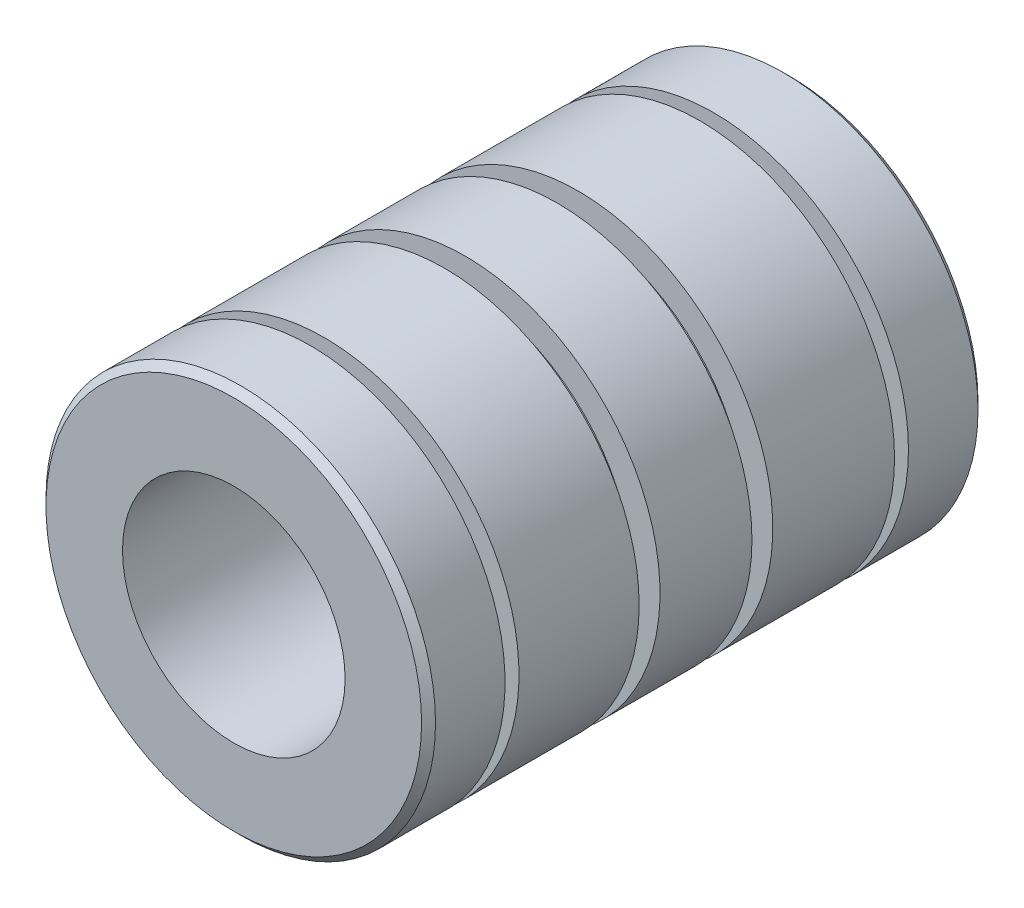
ISO-10303-21;
HEADER;
FILE_DESCRIPTION(('STEP AP214'),'2;1');
FILE_NAME('part.step','',(''),(''),'','','');
FILE_SCHEMA(('AUTOMOTIVE_DESIGN { 1 0 10303 214 1 1 1 1 }'));
ENDSEC;
DATA;
#1=APPLICATION_CONTEXT('core data for automotive mechanical design processes');
#2=APPLICATION_PROTOCOL_DEFINITION('international standard','automotive_design',2000,#1);
#3=PRODUCT_CONTEXT('',#1,'mechanical');
#4=PRODUCT('Part','Part','',(#3));
#5=PRODUCT_RELATED_PRODUCT_CATEGORY('part','',(#4));
#6=PRODUCT_DEFINITION_FORMATION('','',#4);
#7=PRODUCT_DEFINITION_CONTEXT('part definition',#1,'design');
#8=PRODUCT_DEFINITION('design','',#6,#7);
#9=PRODUCT_DEFINITION_SHAPE('','',#8);
#10=(LENGTH_UNIT() NAMED_UNIT(*) SI_UNIT(.MILLI.,.METRE.));
#11=(NAMED_UNIT(*) PLANE_ANGLE_UNIT() SI_UNIT($,.RADIAN.));
#12=(NAMED_UNIT(*) SI_UNIT($,.STERADIAN.) SOLID_ANGLE_UNIT());
#13=UNCERTAINTY_MEASURE_WITH_UNIT(LENGTH_MEASURE(1.E-05),#10,'distance_accuracy_value','');
#14=(GEOMETRIC_REPRESENTATION_CONTEXT(3) GLOBAL_UNCERTAINTY_ASSIGNED_CONTEXT((#13)) GLOBAL_UNIT_ASSIGNED_CONTEXT((#10,
#11,#12)) REPRESENTATION_CONTEXT('',''));
#15=CARTESIAN_POINT('',(0.,0.,0.));
#16=DIRECTION('',(0.,0.,1.));
#17=DIRECTION('',(1.,0.,0.));
#18=AXIS2_PLACEMENT_3D('',#15,#16,#17);
#19=CARTESIAN_POINT('',(0.,0.,31.75));
#20=DIRECTION('',(0.,0.,-1.));
#21=DIRECTION('',(-1.,0.,0.));
#22=AXIS2_PLACEMENT_3D('',#19,#20,#21);
#23=CYLINDRICAL_SURFACE('',#22,11.1125);
#24=CARTESIAN_POINT('',(0.,0.,19.7330901235873));
#25=DIRECTION('',(0.,0.,1.));
#26=DIRECTION('',(1.,0.,0.));
#27=AXIS2_PLACEMENT_3D('',#24,#25,#26);
#28=CIRCLE('',#27,11.1125);
#29=CARTESIAN_POINT('',(11.1125,0.,19.7330901235873));
#30=VERTEX_POINT('',#29);
#31=EDGE_CURVE('E48',#30,#30,#28,.T.);
#32=ORIENTED_EDGE('',*,*,#31,.T.);
#33=EDGE_LOOP('',(#32));
#34=FACE_BOUND('',#33,.T.);
#35=CARTESIAN_POINT('',(0.,0.,26.590625));
#36=DIRECTION('',(0.,0.,-1.));
#37=DIRECTION('',(-1.,0.,0.));
#38=AXIS2_PLACEMENT_3D('',#35,#36,#37);
#39=CIRCLE('',#38,11.1125);
#40=CARTESIAN_POINT('',(-11.1125,0.,26.590625));
#41=VERTEX_POINT('',#40);
#42=EDGE_CURVE('E100',#41,#41,#39,.T.);
#43=ORIENTED_EDGE('',*,*,#42,.T.);
#44=EDGE_LOOP('',(#43));
#45=FACE_BOUND('',#44,.T.);
#46=ADVANCED_FACE('F44',(#34,#45),#23,.T.);
#47=CARTESIAN_POINT('',(0.,0.,12.1046875));
#48=DIRECTION('',(0.,0.,-1.));
#49=DIRECTION('',(-1.,0.,0.));
#50=AXIS2_PLACEMENT_3D('',#47,#48,#49);
#51=CIRCLE('',#50,11.1125);
#52=CARTESIAN_POINT('',(-11.1125,0.,12.1046875));
#53=VERTEX_POINT('',#52);
#54=EDGE_CURVE('E64',#53,#53,#51,.T.);
#55=ORIENTED_EDGE('',*,*,#54,.T.);
#56=EDGE_LOOP('',(#55));
#57=FACE_BOUND('',#56,.T.);
#58=CARTESIAN_POINT('',(0.,0.,5.15937499999999));
#59=DIRECTION('',(0.,0.,1.));
#60=DIRECTION('',(1.,0.,0.));
#61=AXIS2_PLACEMENT_3D('',#58,#59,#60);
#62=CIRCLE('',#61,11.1125);
#63=CARTESIAN_POINT('',(11.1125,0.,5.15937499999999));
#64=VERTEX_POINT('',#63);
#65=EDGE_CURVE('E97',#64,#64,#62,.T.);
#66=ORIENTED_EDGE('',*,*,#65,.T.);
#67=EDGE_LOOP('',(#66));
#68=FACE_BOUND('',#67,.T.);
#69=ADVANCED_FACE('F134',(#57,#68),#23,.T.);
#70=CARTESIAN_POINT('',(0.,0.,0.396874999999991));
#71=DIRECTION('',(0.,0.,1.));
#72=DIRECTION('',(1.,0.,0.));
#73=AXIS2_PLACEMENT_3D('',#70,#71,#72);
#74=CIRCLE('',#73,11.1125);
#75=CARTESIAN_POINT('',(11.1125,0.,0.396874999999991));
#76=VERTEX_POINT('',#75);
#77=EDGE_CURVE('E104',#76,#76,#74,.T.);
#78=ORIENTED_EDGE('',*,*,#77,.T.);
#79=EDGE_LOOP('',(#78));
#80=FACE_BOUND('',#79,.T.);
#81=CARTESIAN_POINT('',(0.,0.,4.36562500000001));
#82=DIRECTION('',(0.,0.,1.));
#83=DIRECTION('',(1.,0.,0.));
#84=AXIS2_PLACEMENT_3D('',#81,#82,#83);
#85=CIRCLE('',#84,11.1125);
#86=CARTESIAN_POINT('',(11.1125,0.,4.36562500000001));
#87=VERTEX_POINT('',#86);
#88=EDGE_CURVE('E92',#87,#87,#85,.T.);
#89=ORIENTED_EDGE('',*,*,#88,.F.);
#90=EDGE_LOOP('',(#89));
#91=FACE_BOUND('',#90,.T.);
#92=ADVANCED_FACE('F130',(#80,#91),#23,.T.);
#93=CARTESIAN_POINT('',(0.,0.,31.353125));
#94=DIRECTION('',(0.,0.,1.));
#95=DIRECTION('',(1.,0.,0.));
#96=AXIS2_PLACEMENT_3D('',#93,#94,#95);
#97=CIRCLE('',#96,11.1125);
#98=CARTESIAN_POINT('',(11.1125,0.,31.353125));
#99=VERTEX_POINT('',#98);
#100=EDGE_CURVE('E12',#99,#99,#97,.F.);
#101=ORIENTED_EDGE('',*,*,#100,.T.);
#102=EDGE_LOOP('',(#101));
#103=FACE_BOUND('',#102,.T.);
#104=CARTESIAN_POINT('',(0.,0.,27.384375));
#105=DIRECTION('',(0.,0.,-1.));
#106=DIRECTION('',(-1.,0.,0.));
#107=AXIS2_PLACEMENT_3D('',#104,#105,#106);
#108=CIRCLE('',#107,11.1125);
#109=CARTESIAN_POINT('',(-11.1125,0.,27.384375));
#110=VERTEX_POINT('',#109);
#111=EDGE_CURVE('E108',#110,#110,#108,.T.);
#112=ORIENTED_EDGE('',*,*,#111,.F.);
#113=EDGE_LOOP('',(#112));
#114=FACE_BOUND('',#113,.T.);
#115=ADVANCED_FACE('F133',(#103,#114),#23,.T.);
#116=CARTESIAN_POINT('',(0.,0.,18.5424651235873));
#117=DIRECTION('',(0.,0.,-1.));
#118=DIRECTION('',(-1.,0.,0.));
#119=AXIS2_PLACEMENT_3D('',#116,#117,#118);
#120=CIRCLE('',#119,11.1125);
#121=CARTESIAN_POINT('',(-11.1125,0.,18.5424651235873));
#122=VERTEX_POINT('',#121);
#123=EDGE_CURVE('E68',#122,#122,#120,.T.);
#124=ORIENTED_EDGE('',*,*,#123,.T.);
#125=EDGE_LOOP('',(#124));
#126=FACE_BOUND('',#125,.T.);
#127=CARTESIAN_POINT('',(0.,0.,13.2953125));
#128=DIRECTION('',(0.,0.,1.));
#129=DIRECTION('',(1.,0.,0.));
#130=AXIS2_PLACEMENT_3D('',#127,#128,#129);
#131=CIRCLE('',#130,11.1125);
#132=CARTESIAN_POINT('',(11.1125,0.,13.2953125));
#133=VERTEX_POINT('',#132);
#134=EDGE_CURVE('E61',#133,#133,#131,.T.);
#135=ORIENTED_EDGE('',*,*,#134,.T.);
#136=EDGE_LOOP('',(#135));
#137=FACE_BOUND('',#136,.T.);
#138=ADVANCED_FACE('F156',(#126,#137),#23,.T.);
#139=CARTESIAN_POINT('',(0.,0.,31.75));
#140=DIRECTION('',(0.,0.,1.));
#141=DIRECTION('',(1.,0.,0.));
#142=AXIS2_PLACEMENT_3D('',#139,#140,#141);
#143=PLANE('',#142);
#144=CARTESIAN_POINT('',(0.,0.,31.75));
#145=DIRECTION('',(0.,0.,1.));
#146=DIRECTION('',(1.,0.,0.));
#147=AXIS2_PLACEMENT_3D('',#144,#145,#146);
#148=CIRCLE('',#147,10.715625);
#149=CARTESIAN_POINT('',(10.715625,0.,31.75));
#150=VERTEX_POINT('',#149);
#151=EDGE_CURVE('E52',#150,#150,#148,.T.);
#152=ORIENTED_EDGE('',*,*,#151,.T.);
#153=EDGE_LOOP('',(#152));
#154=FACE_BOUND('',#153,.T.);
#155=CARTESIAN_POINT('',(0.,0.,31.75));
#156=DIRECTION('',(0.,0.,1.));
#157=DIRECTION('',(1.,0.,0.));
#158=AXIS2_PLACEMENT_3D('',#155,#156,#157);
#159=CIRCLE('',#158,6.35);
#160=CARTESIAN_POINT('',(6.35,0.,31.75));
#161=VERTEX_POINT('',#160);
#162=EDGE_CURVE('E105',#161,#161,#159,.T.);
#163=ORIENTED_EDGE('',*,*,#162,.F.);
#164=EDGE_LOOP('',(#163));
#165=FACE_BOUND('',#164,.T.);
#166=ADVANCED_FACE('F164',(#154,#165),#143,.T.);
#167=CARTESIAN_POINT('',(0.,0.,0.));
#168=DIRECTION('',(0.,0.,1.));
#169=DIRECTION('',(1.,0.,0.));
#170=AXIS2_PLACEMENT_3D('',#167,#168,#169);
#171=PLANE('',#170);
#172=CARTESIAN_POINT('',(0.,0.,0.));
#173=DIRECTION('',(0.,0.,1.));
#174=DIRECTION('',(1.,0.,0.));
#175=AXIS2_PLACEMENT_3D('',#172,#173,#174);
#176=CIRCLE('',#175,10.715625);
#177=CARTESIAN_POINT('',(10.715625,0.,0.));
#178=VERTEX_POINT('',#177);
#179=EDGE_CURVE('E57',#178,#178,#176,.F.);
#180=ORIENTED_EDGE('',*,*,#179,.T.);
#181=EDGE_LOOP('',(#180));
#182=FACE_BOUND('',#181,.T.);
#183=CARTESIAN_POINT('',(0.,0.,0.));
#184=DIRECTION('',(0.,0.,1.));
#185=DIRECTION('',(1.,0.,0.));
#186=AXIS2_PLACEMENT_3D('',#183,#184,#185);
#187=CIRCLE('',#186,6.35);
#188=CARTESIAN_POINT('',(6.35,0.,0.));
#189=VERTEX_POINT('',#188);
#190=EDGE_CURVE('E101',#189,#189,#187,.T.);
#191=ORIENTED_EDGE('',*,*,#190,.T.);
#192=EDGE_LOOP('',(#191));
#193=FACE_BOUND('',#192,.T.);
#194=ADVANCED_FACE('F121',(#182,#193),#171,.F.);
#195=CARTESIAN_POINT('',(0.,0.,0.));
#196=DIRECTION('',(0.,0.,1.));
#197=DIRECTION('',(1.,0.,0.));
#198=AXIS2_PLACEMENT_3D('',#195,#196,#197);
#199=CYLINDRICAL_SURFACE('',#198,6.35);
#200=ORIENTED_EDGE('',*,*,#190,.F.);
#201=EDGE_LOOP('',(#200));
#202=FACE_BOUND('',#201,.T.);
#203=ORIENTED_EDGE('',*,*,#162,.T.);
#204=EDGE_LOOP('',(#203));
#205=FACE_BOUND('',#204,.T.);
#206=ADVANCED_FACE('F270',(#202,#205),#199,.F.);
#207=CARTESIAN_POINT('',(12.7,0.,27.384375));
#208=DIRECTION('',(0.,0.,-1.));
#209=DIRECTION('',(-1.,0.,0.));
#210=AXIS2_PLACEMENT_3D('',#207,#208,#209);
#211=PLANE('',#210);
#212=CARTESIAN_POINT('',(0.,0.,27.384375));
#213=DIRECTION('',(0.,0.,1.));
#214=DIRECTION('',(1.,0.,0.));
#215=AXIS2_PLACEMENT_3D('',#212,#213,#214);
#216=CIRCLE('',#215,9.52499999999999);
#217=CARTESIAN_POINT('',(9.52499999999999,0.,27.384375));
#218=VERTEX_POINT('',#217);
#219=EDGE_CURVE('E96',#218,#218,#216,.T.);
#220=ORIENTED_EDGE('',*,*,#219,.T.);
#221=EDGE_LOOP('',(#220));
#222=FACE_BOUND('',#221,.T.);
#223=ORIENTED_EDGE('',*,*,#111,.T.);
#224=EDGE_LOOP('',(#223));
#225=FACE_BOUND('',#224,.T.);
#226=ADVANCED_FACE('F263',(#222,#225),#211,.T.);
#227=CARTESIAN_POINT('',(12.7,0.,26.590625));
#228=DIRECTION('',(0.,0.,-1.));
#229=DIRECTION('',(-1.,0.,0.));
#230=AXIS2_PLACEMENT_3D('',#227,#228,#229);
#231=PLANE('',#230);
#232=CARTESIAN_POINT('',(0.,0.,26.590625));
#233=DIRECTION('',(0.,0.,1.));
#234=DIRECTION('',(1.,0.,0.));
#235=AXIS2_PLACEMENT_3D('',#232,#233,#234);
#236=CIRCLE('',#235,9.52499999999999);
#237=CARTESIAN_POINT('',(9.52499999999999,0.,26.590625));
#238=VERTEX_POINT('',#237);
#239=EDGE_CURVE('E93',#238,#238,#236,.T.);
#240=ORIENTED_EDGE('',*,*,#239,.F.);
#241=EDGE_LOOP('',(#240));
#242=FACE_BOUND('',#241,.T.);
#243=ORIENTED_EDGE('',*,*,#42,.F.);
#244=EDGE_LOOP('',(#243));
#245=FACE_BOUND('',#244,.T.);
#246=ADVANCED_FACE('F255',(#242,#245),#231,.F.);
#247=CARTESIAN_POINT('',(0.,0.,31.75));
#248=DIRECTION('',(0.,0.,1.));
#249=DIRECTION('',(1.,0.,0.));
#250=AXIS2_PLACEMENT_3D('',#247,#248,#249);
#251=CYLINDRICAL_SURFACE('',#250,9.52499999999999);
#252=ORIENTED_EDGE('',*,*,#219,.F.);
#253=EDGE_LOOP('',(#252));
#254=FACE_BOUND('',#253,.T.);
#255=ORIENTED_EDGE('',*,*,#239,.T.);
#256=EDGE_LOOP('',(#255));
#257=FACE_BOUND('',#256,.T.);
#258=ADVANCED_FACE('F149',(#254,#257),#251,.T.);
#259=CARTESIAN_POINT('',(9.52499999999999,0.,5.15937499999999));
#260=DIRECTION('',(0.,0.,1.));
#261=DIRECTION('',(1.,0.,0.));
#262=AXIS2_PLACEMENT_3D('',#259,#260,#261);
#263=PLANE('',#262);
#264=CARTESIAN_POINT('',(0.,0.,5.15937499999999));
#265=DIRECTION('',(0.,0.,1.));
#266=DIRECTION('',(1.,0.,0.));
#267=AXIS2_PLACEMENT_3D('',#264,#265,#266);
#268=CIRCLE('',#267,9.525);
#269=CARTESIAN_POINT('',(9.525,0.,5.15937499999999));
#270=VERTEX_POINT('',#269);
#271=EDGE_CURVE('E67',#270,#270,#268,.T.);
#272=ORIENTED_EDGE('',*,*,#271,.T.);
#273=EDGE_LOOP('',(#272));
#274=FACE_BOUND('',#273,.T.);
#275=ORIENTED_EDGE('',*,*,#65,.F.);
#276=EDGE_LOOP('',(#275));
#277=FACE_BOUND('',#276,.T.);
#278=ADVANCED_FACE('F140',(#274,#277),#263,.F.);
#279=CARTESIAN_POINT('',(9.52499999999999,0.,4.36562500000001));
#280=DIRECTION('',(0.,0.,1.));
#281=DIRECTION('',(1.,0.,0.));
#282=AXIS2_PLACEMENT_3D('',#279,#280,#281);
#283=PLANE('',#282);
#284=CARTESIAN_POINT('',(0.,0.,4.36562500000001));
#285=DIRECTION('',(0.,0.,1.));
#286=DIRECTION('',(1.,0.,0.));
#287=AXIS2_PLACEMENT_3D('',#284,#285,#286);
#288=CIRCLE('',#287,9.525);
#289=CARTESIAN_POINT('',(9.525,0.,4.36562500000001));
#290=VERTEX_POINT('',#289);
#291=EDGE_CURVE('E89',#290,#290,#288,.T.);
#292=ORIENTED_EDGE('',*,*,#291,.F.);
#293=EDGE_LOOP('',(#292));
#294=FACE_BOUND('',#293,.T.);
#295=ORIENTED_EDGE('',*,*,#88,.T.);
#296=EDGE_LOOP('',(#295));
#297=FACE_BOUND('',#296,.T.);
#298=ADVANCED_FACE('F138',(#294,#297),#283,.T.);
#299=CARTESIAN_POINT('',(0.,0.,31.75));
#300=DIRECTION('',(0.,0.,1.));
#301=DIRECTION('',(1.,0.,0.));
#302=AXIS2_PLACEMENT_3D('',#299,#300,#301);
#303=CYLINDRICAL_SURFACE('',#302,9.525);
#304=ORIENTED_EDGE('',*,*,#271,.F.);
#305=EDGE_LOOP('',(#304));
#306=FACE_BOUND('',#305,.T.);
#307=ORIENTED_EDGE('',*,*,#291,.T.);
#308=EDGE_LOOP('',(#307));
#309=FACE_BOUND('',#308,.T.);
#310=ADVANCED_FACE('F127',(#306,#309),#303,.T.);
#311=CARTESIAN_POINT('',(0.,0.,0.396874999999991));
#312=DIRECTION('',(0.,0.,1.));
#313=DIRECTION('',(1.,0.,0.));
#314=AXIS2_PLACEMENT_3D('',#311,#312,#313);
#315=CONICAL_SURFACE('',#314,11.1125,0.785398163397455);
#316=ORIENTED_EDGE('',*,*,#179,.F.);
#317=EDGE_LOOP('',(#316));
#318=FACE_BOUND('',#317,.T.);
#319=ORIENTED_EDGE('',*,*,#77,.F.);
#320=EDGE_LOOP('',(#319));
#321=FACE_BOUND('',#320,.T.);
#322=ADVANCED_FACE('F124',(#318,#321),#315,.T.);
#323=CARTESIAN_POINT('',(0.,0.,31.75));
#324=DIRECTION('',(0.,0.,-1.));
#325=DIRECTION('',(-1.,0.,0.));
#326=AXIS2_PLACEMENT_3D('',#323,#324,#325);
#327=CONICAL_SURFACE('',#326,10.715625,0.785398163397442);
#328=ORIENTED_EDGE('',*,*,#100,.F.);
#329=EDGE_LOOP('',(#328));
#330=FACE_BOUND('',#329,.T.);
#331=ORIENTED_EDGE('',*,*,#151,.F.);
#332=EDGE_LOOP('',(#331));
#333=FACE_BOUND('',#332,.T.);
#334=ADVANCED_FACE('F46',(#330,#333),#327,.T.);
#335=CARTESIAN_POINT('',(9.52500000000001,0.,12.1046875));
#336=DIRECTION('',(0.,0.,-1.));
#337=DIRECTION('',(-1.,0.,0.));
#338=AXIS2_PLACEMENT_3D('',#335,#336,#337);
#339=PLANE('',#338);
#340=CARTESIAN_POINT('',(0.,0.,12.1046875));
#341=DIRECTION('',(0.,0.,1.));
#342=DIRECTION('',(1.,0.,0.));
#343=AXIS2_PLACEMENT_3D('',#340,#341,#342);
#344=CIRCLE('',#343,9.525);
#345=CARTESIAN_POINT('',(9.525,0.,12.1046875));
#346=VERTEX_POINT('',#345);
#347=EDGE_CURVE('E65',#346,#346,#344,.T.);
#348=ORIENTED_EDGE('',*,*,#347,.F.);
#349=EDGE_LOOP('',(#348));
#350=FACE_BOUND('',#349,.T.);
#351=ORIENTED_EDGE('',*,*,#54,.F.);
#352=EDGE_LOOP('',(#351));
#353=FACE_BOUND('',#352,.T.);
#354=ADVANCED_FACE('F177',(#350,#353),#339,.F.);
#355=CARTESIAN_POINT('',(9.52500000000001,0.,13.2953125));
#356=DIRECTION('',(0.,0.,1.));
#357=DIRECTION('',(1.,0.,0.));
#358=AXIS2_PLACEMENT_3D('',#355,#356,#357);
#359=PLANE('',#358);
#360=CARTESIAN_POINT('',(0.,0.,13.2953125));
#361=DIRECTION('',(0.,0.,1.));
#362=DIRECTION('',(1.,0.,0.));
#363=AXIS2_PLACEMENT_3D('',#360,#361,#362);
#364=CIRCLE('',#363,9.525);
#365=CARTESIAN_POINT('',(9.525,0.,13.2953125));
#366=VERTEX_POINT('',#365);
#367=EDGE_CURVE('E74',#366,#366,#364,.T.);
#368=ORIENTED_EDGE('',*,*,#367,.T.);
#369=EDGE_LOOP('',(#368));
#370=FACE_BOUND('',#369,.T.);
#371=ORIENTED_EDGE('',*,*,#134,.F.);
#372=EDGE_LOOP('',(#371));
#373=FACE_BOUND('',#372,.T.);
#374=ADVANCED_FACE('F174',(#370,#373),#359,.F.);
#375=CARTESIAN_POINT('',(0.,0.,31.353125));
#376=DIRECTION('',(0.,0.,1.));
#377=DIRECTION('',(1.,0.,0.));
#378=AXIS2_PLACEMENT_3D('',#375,#376,#377);
#379=CYLINDRICAL_SURFACE('',#378,9.525);
#380=ORIENTED_EDGE('',*,*,#367,.F.);
#381=EDGE_LOOP('',(#380));
#382=FACE_BOUND('',#381,.T.);
#383=ORIENTED_EDGE('',*,*,#347,.T.);
#384=EDGE_LOOP('',(#383));
#385=FACE_BOUND('',#384,.T.);
#386=ADVANCED_FACE('F176',(#382,#385),#379,.T.);
#387=CARTESIAN_POINT('',(9.52500000000001,0.,19.7330901235873));
#388=DIRECTION('',(0.,0.,1.));
#389=DIRECTION('',(1.,0.,0.));
#390=AXIS2_PLACEMENT_3D('',#387,#388,#389);
#391=PLANE('',#390);
#392=CARTESIAN_POINT('',(0.,0.,19.7330901235873));
#393=DIRECTION('',(0.,0.,1.));
#394=DIRECTION('',(1.,0.,0.));
#395=AXIS2_PLACEMENT_3D('',#392,#393,#394);
#396=CIRCLE('',#395,9.525);
#397=CARTESIAN_POINT('',(9.525,0.,19.7330901235873));
#398=VERTEX_POINT('',#397);
#399=EDGE_CURVE('E70',#398,#398,#396,.T.);
#400=ORIENTED_EDGE('',*,*,#399,.T.);
#401=EDGE_LOOP('',(#400));
#402=FACE_BOUND('',#401,.T.);
#403=ORIENTED_EDGE('',*,*,#31,.F.);
#404=EDGE_LOOP('',(#403));
#405=FACE_BOUND('',#404,.T.);
#406=ADVANCED_FACE('F184',(#402,#405),#391,.F.);
#407=CARTESIAN_POINT('',(9.52500000000001,0.,18.5424651235873));
#408=DIRECTION('',(0.,0.,-1.));
#409=DIRECTION('',(-1.,0.,0.));
#410=AXIS2_PLACEMENT_3D('',#407,#408,#409);
#411=PLANE('',#410);
#412=CARTESIAN_POINT('',(0.,0.,18.5424651235873));
#413=DIRECTION('',(0.,0.,1.));
#414=DIRECTION('',(1.,0.,0.));
#415=AXIS2_PLACEMENT_3D('',#412,#413,#414);
#416=CIRCLE('',#415,9.525);
#417=CARTESIAN_POINT('',(9.525,0.,18.5424651235873));
#418=VERTEX_POINT('',#417);
#419=EDGE_CURVE('E76',#418,#418,#416,.T.);
#420=ORIENTED_EDGE('',*,*,#419,.F.);
#421=EDGE_LOOP('',(#420));
#422=FACE_BOUND('',#421,.T.);
#423=ORIENTED_EDGE('',*,*,#123,.F.);
#424=EDGE_LOOP('',(#423));
#425=FACE_BOUND('',#424,.T.);
#426=ADVANCED_FACE('F192',(#422,#425),#411,.F.);
#427=CARTESIAN_POINT('',(0.,0.,31.353125));
#428=DIRECTION('',(0.,0.,1.));
#429=DIRECTION('',(1.,0.,0.));
#430=AXIS2_PLACEMENT_3D('',#427,#428,#429);
#431=CYLINDRICAL_SURFACE('',#430,9.525);
#432=ORIENTED_EDGE('',*,*,#399,.F.);
#433=EDGE_LOOP('',(#432));
#434=FACE_BOUND('',#433,.T.);
#435=ORIENTED_EDGE('',*,*,#419,.T.);
#436=EDGE_LOOP('',(#435));
#437=FACE_BOUND('',#436,.T.);
#438=ADVANCED_FACE('F193',(#434,#437),#431,.T.);
#439=CLOSED_SHELL('',(#46,#69,#92,#115,#138,#166,#194,#206,#226,#246,#258,#278,#298,#310,#322,
#334,#354,#374,#386,#406,#426,#438));
#440=MANIFOLD_SOLID_BREP('B2',#439);
#441=ADVANCED_BREP_SHAPE_REPRESENTATION('',(#18,#440),#14);
#442=SHAPE_DEFINITION_REPRESENTATION(#9,#441);
ENDSEC;
END-ISO-10303-21;
